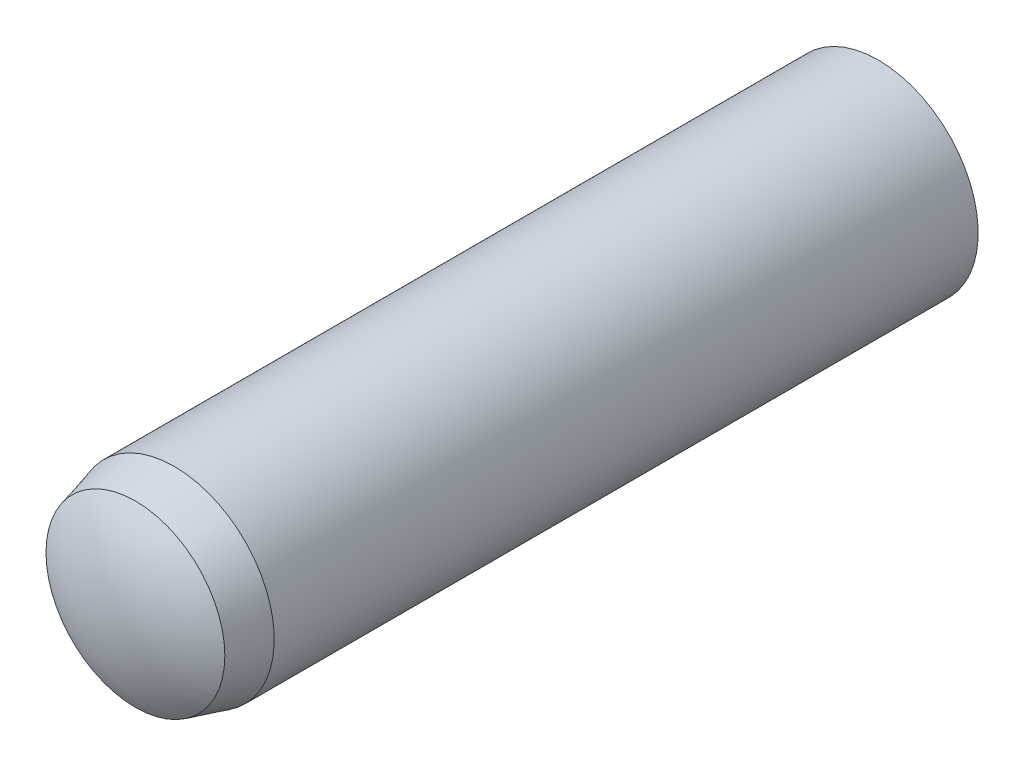
ISO-10303-21;
HEADER;
FILE_DESCRIPTION(('STEP AP214'),'2;1');
FILE_NAME('part.step','',(''),(''),'','','');
FILE_SCHEMA(('AUTOMOTIVE_DESIGN { 1 0 10303 214 1 1 1 1 }'));
ENDSEC;
DATA;
#1=APPLICATION_CONTEXT('core data for automotive mechanical design processes');
#2=APPLICATION_PROTOCOL_DEFINITION('international standard','automotive_design',2000,#1);
#3=PRODUCT_CONTEXT('',#1,'mechanical');
#4=PRODUCT('Part','Part','',(#3));
#5=PRODUCT_RELATED_PRODUCT_CATEGORY('part','',(#4));
#6=PRODUCT_DEFINITION_FORMATION('','',#4);
#7=PRODUCT_DEFINITION_CONTEXT('part definition',#1,'design');
#8=PRODUCT_DEFINITION('design','',#6,#7);
#9=PRODUCT_DEFINITION_SHAPE('','',#8);
#10=(LENGTH_UNIT() NAMED_UNIT(*) SI_UNIT(.MILLI.,.METRE.));
#11=(NAMED_UNIT(*) PLANE_ANGLE_UNIT() SI_UNIT($,.RADIAN.));
#12=(NAMED_UNIT(*) SI_UNIT($,.STERADIAN.) SOLID_ANGLE_UNIT());
#13=UNCERTAINTY_MEASURE_WITH_UNIT(LENGTH_MEASURE(1.E-05),#10,'distance_accuracy_value','');
#14=(GEOMETRIC_REPRESENTATION_CONTEXT(3) GLOBAL_UNCERTAINTY_ASSIGNED_CONTEXT((#13)) GLOBAL_UNIT_ASSIGNED_CONTEXT((#10,
#11,#12)) REPRESENTATION_CONTEXT('',''));
#15=CARTESIAN_POINT('',(0.,0.,0.));
#16=DIRECTION('',(0.,0.,1.));
#17=DIRECTION('',(1.,0.,0.));
#18=AXIS2_PLACEMENT_3D('',#15,#16,#17);
#19=CARTESIAN_POINT('',(0.,0.,-5.45833333333334));
#20=DIRECTION('',(0.,0.,1.));
#21=DIRECTION('',(0.,1.,0.));
#22=AXIS2_PLACEMENT_3D('',#19,#20,#21);
#23=SPHERICAL_SURFACE('',#22,4.54166666666666);
#24=CARTESIAN_POINT('',(0.,0.,-9.25));
#25=DIRECTION('',(0.,0.,1.));
#26=DIRECTION('',(0.,-1.,0.));
#27=AXIS2_PLACEMENT_3D('',#24,#25,#26);
#28=CIRCLE('',#27,2.5);
#29=CARTESIAN_POINT('',(0.,-2.5,-9.25));
#30=VERTEX_POINT('',#29);
#31=EDGE_CURVE('E10',#30,#30,#28,.T.);
#32=ORIENTED_EDGE('',*,*,#31,.F.);
#33=EDGE_LOOP('',(#32));
#34=FACE_BOUND('',#33,.T.);
#35=ADVANCED_FACE('F32',(#34),#23,.T.);
#36=CARTESIAN_POINT('',(0.,0.,10.));
#37=DIRECTION('',(0.,0.,1.));
#38=DIRECTION('',(0.,-1.,0.));
#39=AXIS2_PLACEMENT_3D('',#36,#37,#38);
#40=CYLINDRICAL_SURFACE('',#39,2.5);
#41=CARTESIAN_POINT('',(0.,0.,8.375));
#42=DIRECTION('',(0.,0.,1.));
#43=DIRECTION('',(0.,-1.,0.));
#44=AXIS2_PLACEMENT_3D('',#41,#42,#43);
#45=CIRCLE('',#44,2.5);
#46=CARTESIAN_POINT('',(0.,-2.5,8.375));
#47=VERTEX_POINT('',#46);
#48=EDGE_CURVE('E38',#47,#47,#45,.T.);
#49=ORIENTED_EDGE('',*,*,#48,.F.);
#50=EDGE_LOOP('',(#49));
#51=FACE_BOUND('',#50,.T.);
#52=ORIENTED_EDGE('',*,*,#31,.T.);
#53=EDGE_LOOP('',(#52));
#54=FACE_BOUND('',#53,.T.);
#55=ADVANCED_FACE('F53',(#51,#54),#40,.T.);
#56=CARTESIAN_POINT('',(0.,0.,8.375));
#57=DIRECTION('',(0.,0.,-1.));
#58=DIRECTION('',(0.,1.,0.));
#59=AXIS2_PLACEMENT_3D('',#56,#57,#58);
#60=CONICAL_SURFACE('',#59,2.5,0.261799387799149);
#61=CARTESIAN_POINT('',(0.,0.,9.35));
#62=DIRECTION('',(0.,0.,1.));
#63=DIRECTION('',(0.,-1.,0.));
#64=AXIS2_PLACEMENT_3D('',#61,#62,#63);
#65=CIRCLE('',#64,2.23874953737966);
#66=CARTESIAN_POINT('',(0.,-2.23874953737966,9.35));
#67=VERTEX_POINT('',#66);
#68=EDGE_CURVE('E42',#67,#67,#65,.T.);
#69=ORIENTED_EDGE('',*,*,#68,.F.);
#70=EDGE_LOOP('',(#69));
#71=FACE_BOUND('',#70,.T.);
#72=ORIENTED_EDGE('',*,*,#48,.T.);
#73=EDGE_LOOP('',(#72));
#74=FACE_BOUND('',#73,.T.);
#75=ADVANCED_FACE('F51',(#71,#74),#60,.T.);
#76=CARTESIAN_POINT('',(0.,0.,5.81961577606337));
#77=DIRECTION('',(0.,0.,1.));
#78=DIRECTION('',(0.,1.,0.));
#79=AXIS2_PLACEMENT_3D('',#76,#77,#78);
#80=SPHERICAL_SURFACE('',#79,4.18038422393663);
#81=ORIENTED_EDGE('',*,*,#68,.T.);
#82=EDGE_LOOP('',(#81));
#83=FACE_BOUND('',#82,.T.);
#84=ADVANCED_FACE('F49',(#83),#80,.T.);
#85=CLOSED_SHELL('',(#35,#55,#75,#84));
#86=MANIFOLD_SOLID_BREP('B2',#85);
#87=ADVANCED_BREP_SHAPE_REPRESENTATION('',(#18,#86),#14);
#88=SHAPE_DEFINITION_REPRESENTATION(#9,#87);
ENDSEC;
END-ISO-10303-21;
